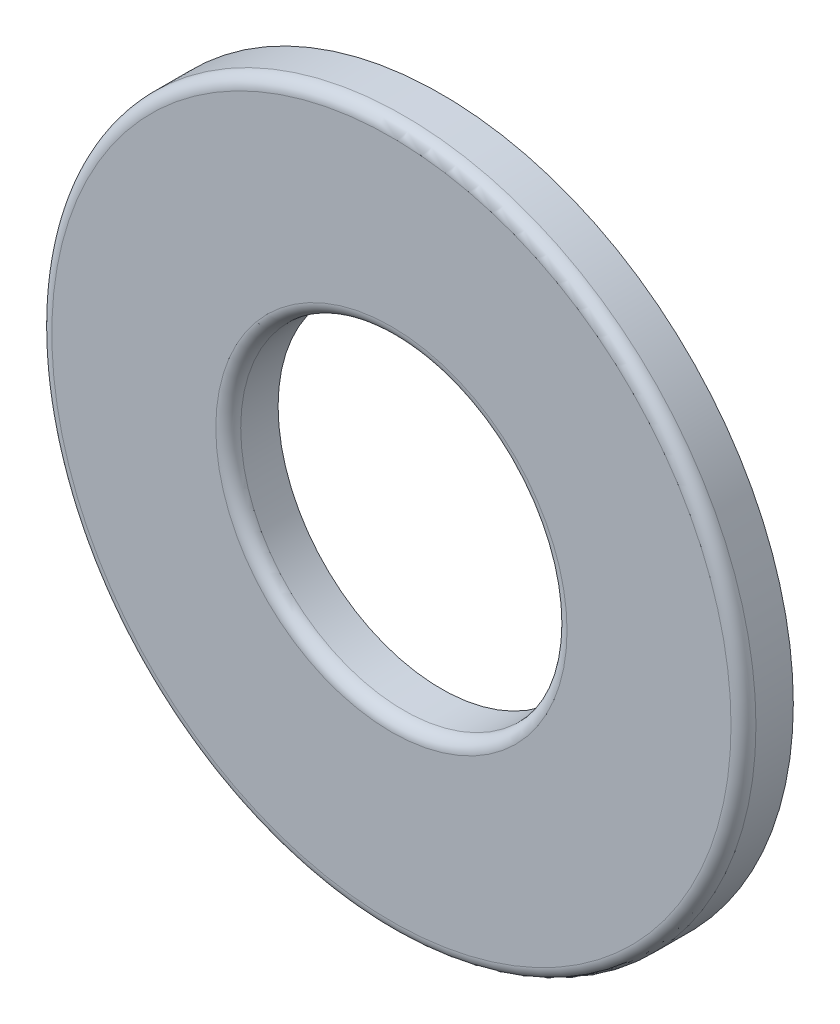
ISO-10303-21;
HEADER;
FILE_DESCRIPTION(('STEP AP214'),'2;1');
FILE_NAME('part.step','',(''),(''),'','','');
FILE_SCHEMA(('AUTOMOTIVE_DESIGN { 1 0 10303 214 1 1 1 1 }'));
ENDSEC;
DATA;
#1=APPLICATION_CONTEXT('core data for automotive mechanical design processes');
#2=APPLICATION_PROTOCOL_DEFINITION('international standard','automotive_design',2000,#1);
#3=PRODUCT_CONTEXT('',#1,'mechanical');
#4=PRODUCT('Part','Part','',(#3));
#5=PRODUCT_RELATED_PRODUCT_CATEGORY('part','',(#4));
#6=PRODUCT_DEFINITION_FORMATION('','',#4);
#7=PRODUCT_DEFINITION_CONTEXT('part definition',#1,'design');
#8=PRODUCT_DEFINITION('design','',#6,#7);
#9=PRODUCT_DEFINITION_SHAPE('','',#8);
#10=(LENGTH_UNIT() NAMED_UNIT(*) SI_UNIT(.MILLI.,.METRE.));
#11=(NAMED_UNIT(*) PLANE_ANGLE_UNIT() SI_UNIT($,.RADIAN.));
#12=(NAMED_UNIT(*) SI_UNIT($,.STERADIAN.) SOLID_ANGLE_UNIT());
#13=UNCERTAINTY_MEASURE_WITH_UNIT(LENGTH_MEASURE(1.E-05),#10,'distance_accuracy_value','');
#14=(GEOMETRIC_REPRESENTATION_CONTEXT(3) GLOBAL_UNCERTAINTY_ASSIGNED_CONTEXT((#13)) GLOBAL_UNIT_ASSIGNED_CONTEXT((#10,
#11,#12)) REPRESENTATION_CONTEXT('',''));
#15=CARTESIAN_POINT('',(0.,0.,0.));
#16=DIRECTION('',(0.,0.,1.));
#17=DIRECTION('',(1.,0.,0.));
#18=AXIS2_PLACEMENT_3D('',#15,#16,#17);
#19=CARTESIAN_POINT('',(0.,0.,0.393699999999996));
#20=DIRECTION('',(0.,0.,1.));
#21=DIRECTION('',(1.,0.,0.));
#22=AXIS2_PLACEMENT_3D('',#19,#20,#21);
#23=PLANE('',#22);
#24=CARTESIAN_POINT('',(0.,0.,0.393699999999996));
#25=DIRECTION('',(0.,0.,1.));
#26=DIRECTION('',(1.,0.,0.));
#27=AXIS2_PLACEMENT_3D('',#24,#25,#26);
#28=CIRCLE('',#27,5.36575);
#29=CARTESIAN_POINT('',(5.36575,0.,0.393699999999996));
#30=VERTEX_POINT('',#29);
#31=EDGE_CURVE('E44',#30,#30,#28,.T.);
#32=ORIENTED_EDGE('',*,*,#31,.T.);
#33=EDGE_LOOP('',(#32));
#34=FACE_BOUND('',#33,.T.);
#35=CARTESIAN_POINT('',(0.,0.,0.393699999999996));
#36=DIRECTION('',(0.,0.,1.));
#37=DIRECTION('',(1.,0.,0.));
#38=AXIS2_PLACEMENT_3D('',#35,#36,#37);
#39=CIRCLE('',#38,2.77495);
#40=CARTESIAN_POINT('',(2.77495,0.,0.393699999999996));
#41=VERTEX_POINT('',#40);
#42=EDGE_CURVE('E48',#41,#41,#39,.F.);
#43=ORIENTED_EDGE('',*,*,#42,.T.);
#44=EDGE_LOOP('',(#43));
#45=FACE_BOUND('',#44,.T.);
#46=ADVANCED_FACE('F33',(#34,#45),#23,.T.);
#47=CARTESIAN_POINT('',(0.,0.,0.393699999999996));
#48=DIRECTION('',(0.,0.,-1.));
#49=DIRECTION('',(-1.,0.,0.));
#50=AXIS2_PLACEMENT_3D('',#47,#48,#49);
#51=CYLINDRICAL_SURFACE('',#50,5.5626);
#52=CARTESIAN_POINT('',(0.,0.,0.196849999999996));
#53=DIRECTION('',(0.,0.,1.));
#54=DIRECTION('',(1.,0.,0.));
#55=AXIS2_PLACEMENT_3D('',#52,#53,#54);
#56=CIRCLE('',#55,5.5626);
#57=CARTESIAN_POINT('',(-5.5626,0.,0.196849999999996));
#58=VERTEX_POINT('',#57);
#59=EDGE_CURVE('E40',#58,#58,#56,.F.);
#60=CARTESIAN_POINT('',(0.,0.,-0.393700000000004));
#61=DIRECTION('',(0.,0.,1.));
#62=DIRECTION('',(1.,0.,0.));
#63=AXIS2_PLACEMENT_3D('',#60,#61,#62);
#64=CIRCLE('',#63,5.5626);
#65=CARTESIAN_POINT('',(-5.5626,0.,-0.393700000000004));
#66=VERTEX_POINT('',#65);
#67=EDGE_CURVE('E53',#66,#66,#64,.T.);
#68=CARTESIAN_POINT('',(-5.5626,0.,0.196849999999996));
#69=CARTESIAN_POINT('',(-5.5626,0.,0.190698437499996));
#70=CARTESIAN_POINT('',(-5.5626,0.,0.184546874999996));
#71=CARTESIAN_POINT('',(-5.5626,0.,0.172243749999996));
#72=CARTESIAN_POINT('',(-5.5626,0.,0.166092187499996));
#73=CARTESIAN_POINT('',(-5.5626,0.,0.153789062499996));
#74=CARTESIAN_POINT('',(-5.5626,0.,0.147637499999996));
#75=CARTESIAN_POINT('',(-5.5626,0.,0.135334374999996));
#76=CARTESIAN_POINT('',(-5.5626,0.,0.129182812499996));
#77=CARTESIAN_POINT('',(-5.5626,0.,0.116879687499996));
#78=CARTESIAN_POINT('',(-5.5626,0.,0.110728124999996));
#79=CARTESIAN_POINT('',(-5.5626,0.,0.0984249999999964));
#80=CARTESIAN_POINT('',(-5.5626,0.,0.0922734374999964));
#81=CARTESIAN_POINT('',(-5.5626,0.,0.0799703124999964));
#82=CARTESIAN_POINT('',(-5.5626,0.,0.0738187499999964));
#83=CARTESIAN_POINT('',(-5.5626,0.,0.0615156249999964));
#84=CARTESIAN_POINT('',(-5.5626,0.,0.0553640624999964));
#85=CARTESIAN_POINT('',(-5.5626,0.,0.0430609374999964));
#86=CARTESIAN_POINT('',(-5.5626,0.,0.0369093749999964));
#87=CARTESIAN_POINT('',(-5.5626,0.,0.0246062499999964));
#88=CARTESIAN_POINT('',(-5.5626,0.,0.0184546874999964));
#89=CARTESIAN_POINT('',(-5.5626,0.,0.00615156249999637));
#90=CARTESIAN_POINT('',(-5.5626,0.,0.));
#91=CARTESIAN_POINT('',(-5.5626,0.,-0.0123031250000036));
#92=CARTESIAN_POINT('',(-5.5626,0.,-0.0184546875000036));
#93=CARTESIAN_POINT('',(-5.5626,0.,-0.0307578125000036));
#94=CARTESIAN_POINT('',(-5.5626,0.,-0.0369093750000036));
#95=CARTESIAN_POINT('',(-5.5626,0.,-0.0492125000000036));
#96=CARTESIAN_POINT('',(-5.5626,0.,-0.0553640625000036));
#97=CARTESIAN_POINT('',(-5.5626,0.,-0.0676671875000036));
#98=CARTESIAN_POINT('',(-5.5626,0.,-0.0738187500000036));
#99=CARTESIAN_POINT('',(-5.5626,0.,-0.0861218750000037));
#100=CARTESIAN_POINT('',(-5.5626,0.,-0.0922734375000036));
#101=CARTESIAN_POINT('',(-5.5626,0.,-0.104576562500004));
#102=CARTESIAN_POINT('',(-5.5626,0.,-0.110728125000004));
#103=CARTESIAN_POINT('',(-5.5626,0.,-0.123031250000004));
#104=CARTESIAN_POINT('',(-5.5626,0.,-0.129182812500004));
#105=CARTESIAN_POINT('',(-5.5626,0.,-0.141485937500004));
#106=CARTESIAN_POINT('',(-5.5626,0.,-0.147637500000004));
#107=CARTESIAN_POINT('',(-5.5626,0.,-0.159940625000004));
#108=CARTESIAN_POINT('',(-5.5626,0.,-0.166092187500004));
#109=CARTESIAN_POINT('',(-5.5626,0.,-0.178395312500004));
#110=CARTESIAN_POINT('',(-5.5626,0.,-0.184546875000004));
#111=CARTESIAN_POINT('',(-5.5626,0.,-0.196850000000004));
#112=CARTESIAN_POINT('',(-5.5626,0.,-0.203001562500004));
#113=CARTESIAN_POINT('',(-5.5626,0.,-0.215304687500004));
#114=CARTESIAN_POINT('',(-5.5626,0.,-0.221456250000004));
#115=CARTESIAN_POINT('',(-5.5626,0.,-0.233759375000004));
#116=CARTESIAN_POINT('',(-5.5626,0.,-0.239910937500004));
#117=CARTESIAN_POINT('',(-5.5626,0.,-0.252214062500004));
#118=CARTESIAN_POINT('',(-5.5626,0.,-0.258365625000004));
#119=CARTESIAN_POINT('',(-5.5626,0.,-0.270668750000004));
#120=CARTESIAN_POINT('',(-5.5626,0.,-0.276820312500004));
#121=CARTESIAN_POINT('',(-5.5626,0.,-0.289123437500004));
#122=CARTESIAN_POINT('',(-5.5626,0.,-0.295275000000004));
#123=CARTESIAN_POINT('',(-5.5626,0.,-0.307578125000004));
#124=CARTESIAN_POINT('',(-5.5626,0.,-0.313729687500004));
#125=CARTESIAN_POINT('',(-5.5626,0.,-0.326032812500004));
#126=CARTESIAN_POINT('',(-5.5626,0.,-0.332184375000004));
#127=CARTESIAN_POINT('',(-5.5626,0.,-0.344487500000004));
#128=CARTESIAN_POINT('',(-5.5626,0.,-0.350639062500004));
#129=CARTESIAN_POINT('',(-5.5626,0.,-0.362942187500004));
#130=CARTESIAN_POINT('',(-5.5626,0.,-0.369093750000004));
#131=CARTESIAN_POINT('',(-5.5626,0.,-0.381396875000004));
#132=CARTESIAN_POINT('',(-5.5626,0.,-0.387548437500004));
#133=CARTESIAN_POINT('',(-5.5626,0.,-0.393700000000004));
#134=B_SPLINE_CURVE_WITH_KNOTS('',3,(#68,#69,#70,#71,#72,#73,#74,#75,#76,#77,#78,#79,#80,#81,
#82,#83,#84,#85,#86,#87,#88,#89,#90,#91,#92,#93,#94,#95,#96,#97,#98,#99,#100,#101,#102,#103,
#104,#105,#106,#107,#108,#109,#110,#111,#112,#113,#114,#115,#116,#117,#118,#119,#120,#121,#122,
#123,#124,#125,#126,#127,#128,#129,#130,#131,#132,#133),.UNSPECIFIED.,.F.,.F.,(4,2,2,2,2,2,2,2,
2,2,2,2,2,2,2,2,2,2,2,2,2,2,2,2,2,2,2,2,2,2,2,2,4),(0.,0.0184546875,0.036909375,0.0553640625,
0.07381875,0.0922734375,0.110728125,0.1291828125,0.1476375,0.1660921875,0.184546875,
0.2030015625,0.22145625,0.2399109375,0.258365625,0.2768203125,0.295275,0.3137296875,0.332184375,
0.3506390625,0.36909375,0.3875484375,0.406003125,0.4244578125,0.4429125,0.4613671875,
0.479821875,0.4982765625,0.51673125,0.5351859375,0.553640625,0.5720953125,0.59055),.UNSPECIFIED.);
#135=EDGE_CURVE('BSEAM65',#58,#66,#134,.T.);
#136=ORIENTED_EDGE('',*,*,#59,.T.);
#137=ORIENTED_EDGE('',*,*,#67,.T.);
#138=ORIENTED_EDGE('',*,*,#135,.T.);
#139=ORIENTED_EDGE('',*,*,#135,.F.);
#140=EDGE_LOOP('',(#136,#138,#137,#139));
#141=FACE_BOUND('',#140,.T.);
#142=ADVANCED_FACE('F65',(#141),#51,.T.);
#143=CARTESIAN_POINT('',(0.,0.,0.393699999999996));
#144=DIRECTION('',(0.,0.,-1.));
#145=DIRECTION('',(-1.,0.,0.));
#146=AXIS2_PLACEMENT_3D('',#143,#144,#145);
#147=CYLINDRICAL_SURFACE('',#146,2.5781);
#148=CARTESIAN_POINT('',(0.,0.,0.196849999999996));
#149=DIRECTION('',(0.,0.,1.));
#150=DIRECTION('',(1.,0.,0.));
#151=AXIS2_PLACEMENT_3D('',#148,#149,#150);
#152=CIRCLE('',#151,2.5781);
#153=CARTESIAN_POINT('',(-2.5781,0.,0.196849999999996));
#154=VERTEX_POINT('',#153);
#155=EDGE_CURVE('E10',#154,#154,#152,.T.);
#156=CARTESIAN_POINT('',(0.,0.,-0.393700000000004));
#157=DIRECTION('',(0.,0.,1.));
#158=DIRECTION('',(1.,0.,0.));
#159=AXIS2_PLACEMENT_3D('',#156,#157,#158);
#160=CIRCLE('',#159,2.5781);
#161=CARTESIAN_POINT('',(-2.5781,0.,-0.393700000000004));
#162=VERTEX_POINT('',#161);
#163=EDGE_CURVE('E56',#162,#162,#160,.T.);
#164=CARTESIAN_POINT('',(-2.5781,0.,0.196849999999996));
#165=CARTESIAN_POINT('',(-2.5781,0.,0.190698437499996));
#166=CARTESIAN_POINT('',(-2.5781,0.,0.184546874999996));
#167=CARTESIAN_POINT('',(-2.5781,0.,0.172243749999996));
#168=CARTESIAN_POINT('',(-2.5781,0.,0.166092187499996));
#169=CARTESIAN_POINT('',(-2.5781,0.,0.153789062499996));
#170=CARTESIAN_POINT('',(-2.5781,0.,0.147637499999996));
#171=CARTESIAN_POINT('',(-2.5781,0.,0.135334374999996));
#172=CARTESIAN_POINT('',(-2.5781,0.,0.129182812499996));
#173=CARTESIAN_POINT('',(-2.5781,0.,0.116879687499996));
#174=CARTESIAN_POINT('',(-2.5781,0.,0.110728124999996));
#175=CARTESIAN_POINT('',(-2.5781,0.,0.0984249999999964));
#176=CARTESIAN_POINT('',(-2.5781,0.,0.0922734374999964));
#177=CARTESIAN_POINT('',(-2.5781,0.,0.0799703124999964));
#178=CARTESIAN_POINT('',(-2.5781,0.,0.0738187499999964));
#179=CARTESIAN_POINT('',(-2.5781,0.,0.0615156249999964));
#180=CARTESIAN_POINT('',(-2.5781,0.,0.0553640624999964));
#181=CARTESIAN_POINT('',(-2.5781,0.,0.0430609374999964));
#182=CARTESIAN_POINT('',(-2.5781,0.,0.0369093749999964));
#183=CARTESIAN_POINT('',(-2.5781,0.,0.0246062499999964));
#184=CARTESIAN_POINT('',(-2.5781,0.,0.0184546874999964));
#185=CARTESIAN_POINT('',(-2.5781,0.,0.00615156249999637));
#186=CARTESIAN_POINT('',(-2.5781,0.,0.));
#187=CARTESIAN_POINT('',(-2.5781,0.,-0.0123031250000036));
#188=CARTESIAN_POINT('',(-2.5781,0.,-0.0184546875000036));
#189=CARTESIAN_POINT('',(-2.5781,0.,-0.0307578125000036));
#190=CARTESIAN_POINT('',(-2.5781,0.,-0.0369093750000036));
#191=CARTESIAN_POINT('',(-2.5781,0.,-0.0492125000000036));
#192=CARTESIAN_POINT('',(-2.5781,0.,-0.0553640625000036));
#193=CARTESIAN_POINT('',(-2.5781,0.,-0.0676671875000036));
#194=CARTESIAN_POINT('',(-2.5781,0.,-0.0738187500000036));
#195=CARTESIAN_POINT('',(-2.5781,0.,-0.0861218750000037));
#196=CARTESIAN_POINT('',(-2.5781,0.,-0.0922734375000036));
#197=CARTESIAN_POINT('',(-2.5781,0.,-0.104576562500004));
#198=CARTESIAN_POINT('',(-2.5781,0.,-0.110728125000004));
#199=CARTESIAN_POINT('',(-2.5781,0.,-0.123031250000004));
#200=CARTESIAN_POINT('',(-2.5781,0.,-0.129182812500004));
#201=CARTESIAN_POINT('',(-2.5781,0.,-0.141485937500004));
#202=CARTESIAN_POINT('',(-2.5781,0.,-0.147637500000004));
#203=CARTESIAN_POINT('',(-2.5781,0.,-0.159940625000004));
#204=CARTESIAN_POINT('',(-2.5781,0.,-0.166092187500004));
#205=CARTESIAN_POINT('',(-2.5781,0.,-0.178395312500004));
#206=CARTESIAN_POINT('',(-2.5781,0.,-0.184546875000004));
#207=CARTESIAN_POINT('',(-2.5781,0.,-0.196850000000004));
#208=CARTESIAN_POINT('',(-2.5781,0.,-0.203001562500004));
#209=CARTESIAN_POINT('',(-2.5781,0.,-0.215304687500004));
#210=CARTESIAN_POINT('',(-2.5781,0.,-0.221456250000004));
#211=CARTESIAN_POINT('',(-2.5781,0.,-0.233759375000004));
#212=CARTESIAN_POINT('',(-2.5781,0.,-0.239910937500004));
#213=CARTESIAN_POINT('',(-2.5781,0.,-0.252214062500004));
#214=CARTESIAN_POINT('',(-2.5781,0.,-0.258365625000004));
#215=CARTESIAN_POINT('',(-2.5781,0.,-0.270668750000004));
#216=CARTESIAN_POINT('',(-2.5781,0.,-0.276820312500004));
#217=CARTESIAN_POINT('',(-2.5781,0.,-0.289123437500004));
#218=CARTESIAN_POINT('',(-2.5781,0.,-0.295275000000004));
#219=CARTESIAN_POINT('',(-2.5781,0.,-0.307578125000004));
#220=CARTESIAN_POINT('',(-2.5781,0.,-0.313729687500004));
#221=CARTESIAN_POINT('',(-2.5781,0.,-0.326032812500004));
#222=CARTESIAN_POINT('',(-2.5781,0.,-0.332184375000004));
#223=CARTESIAN_POINT('',(-2.5781,0.,-0.344487500000004));
#224=CARTESIAN_POINT('',(-2.5781,0.,-0.350639062500004));
#225=CARTESIAN_POINT('',(-2.5781,0.,-0.362942187500004));
#226=CARTESIAN_POINT('',(-2.5781,0.,-0.369093750000004));
#227=CARTESIAN_POINT('',(-2.5781,0.,-0.381396875000004));
#228=CARTESIAN_POINT('',(-2.5781,0.,-0.387548437500004));
#229=CARTESIAN_POINT('',(-2.5781,0.,-0.393700000000004));
#230=B_SPLINE_CURVE_WITH_KNOTS('',3,(#164,#165,#166,#167,#168,#169,#170,#171,#172,#173,#174,
#175,#176,#177,#178,#179,#180,#181,#182,#183,#184,#185,#186,#187,#188,#189,#190,#191,#192,#193,
#194,#195,#196,#197,#198,#199,#200,#201,#202,#203,#204,#205,#206,#207,#208,#209,#210,#211,#212,
#213,#214,#215,#216,#217,#218,#219,#220,#221,#222,#223,#224,#225,#226,#227,#228,#229),
.UNSPECIFIED.,.F.,.F.,(4,2,2,2,2,2,2,2,2,2,2,2,2,2,2,2,2,2,2,2,2,2,2,2,2,2,2,2,2,2,2,2,4),(0.,
0.0184546875,0.036909375,0.0553640625,0.07381875,0.0922734375,0.110728125,0.1291828125,
0.1476375,0.1660921875,0.184546875,0.2030015625,0.22145625,0.2399109375,0.258365625,
0.2768203125,0.295275,0.3137296875,0.332184375,0.3506390625,0.36909375,0.3875484375,0.406003125,
0.4244578125,0.4429125,0.4613671875,0.479821875,0.4982765625,0.51673125,0.5351859375,
0.553640625,0.5720953125,0.59055),.UNSPECIFIED.);
#231=EDGE_CURVE('BSEAM63',#154,#162,#230,.T.);
#232=ORIENTED_EDGE('',*,*,#155,.T.);
#233=ORIENTED_EDGE('',*,*,#163,.F.);
#234=ORIENTED_EDGE('',*,*,#231,.T.);
#235=ORIENTED_EDGE('',*,*,#231,.F.);
#236=EDGE_LOOP('',(#232,#234,#233,#235));
#237=FACE_BOUND('',#236,.T.);
#238=ADVANCED_FACE('F63',(#237),#147,.F.);
#239=CARTESIAN_POINT('',(0.,0.,-0.393700000000004));
#240=DIRECTION('',(0.,0.,1.));
#241=DIRECTION('',(1.,0.,0.));
#242=AXIS2_PLACEMENT_3D('',#239,#240,#241);
#243=PLANE('',#242);
#244=ORIENTED_EDGE('',*,*,#163,.T.);
#245=EDGE_LOOP('',(#244));
#246=FACE_BOUND('',#245,.T.);
#247=ORIENTED_EDGE('',*,*,#67,.F.);
#248=EDGE_LOOP('',(#247));
#249=FACE_BOUND('',#248,.T.);
#250=ADVANCED_FACE('F60',(#246,#249),#243,.F.);
#251=CARTESIAN_POINT('',(0.,0.,0.196849999999996));
#252=DIRECTION('',(0.,0.,1.));
#253=DIRECTION('',(1.,0.,0.));
#254=AXIS2_PLACEMENT_3D('',#251,#252,#253);
#255=TOROIDAL_SURFACE('',#254,5.36575,0.19685);
#256=ORIENTED_EDGE('',*,*,#59,.F.);
#257=EDGE_LOOP('',(#256));
#258=FACE_BOUND('',#257,.T.);
#259=ORIENTED_EDGE('',*,*,#31,.F.);
#260=EDGE_LOOP('',(#259));
#261=FACE_BOUND('',#260,.T.);
#262=ADVANCED_FACE('F71',(#258,#261),#255,.T.);
#263=CARTESIAN_POINT('',(0.,0.,0.196849999999996));
#264=DIRECTION('',(0.,0.,1.));
#265=DIRECTION('',(1.,0.,0.));
#266=AXIS2_PLACEMENT_3D('',#263,#264,#265);
#267=TOROIDAL_SURFACE('',#266,2.77495,0.19685);
#268=ORIENTED_EDGE('',*,*,#42,.F.);
#269=EDGE_LOOP('',(#268));
#270=FACE_BOUND('',#269,.T.);
#271=ORIENTED_EDGE('',*,*,#155,.F.);
#272=EDGE_LOOP('',(#271));
#273=FACE_BOUND('',#272,.T.);
#274=ADVANCED_FACE('F35',(#270,#273),#267,.T.);
#275=CLOSED_SHELL('',(#46,#142,#238,#250,#262,#274));
#276=MANIFOLD_SOLID_BREP('B2',#275);
#277=ADVANCED_BREP_SHAPE_REPRESENTATION('',(#18,#276),#14);
#278=SHAPE_DEFINITION_REPRESENTATION(#9,#277);
ENDSEC;
END-ISO-10303-21;
